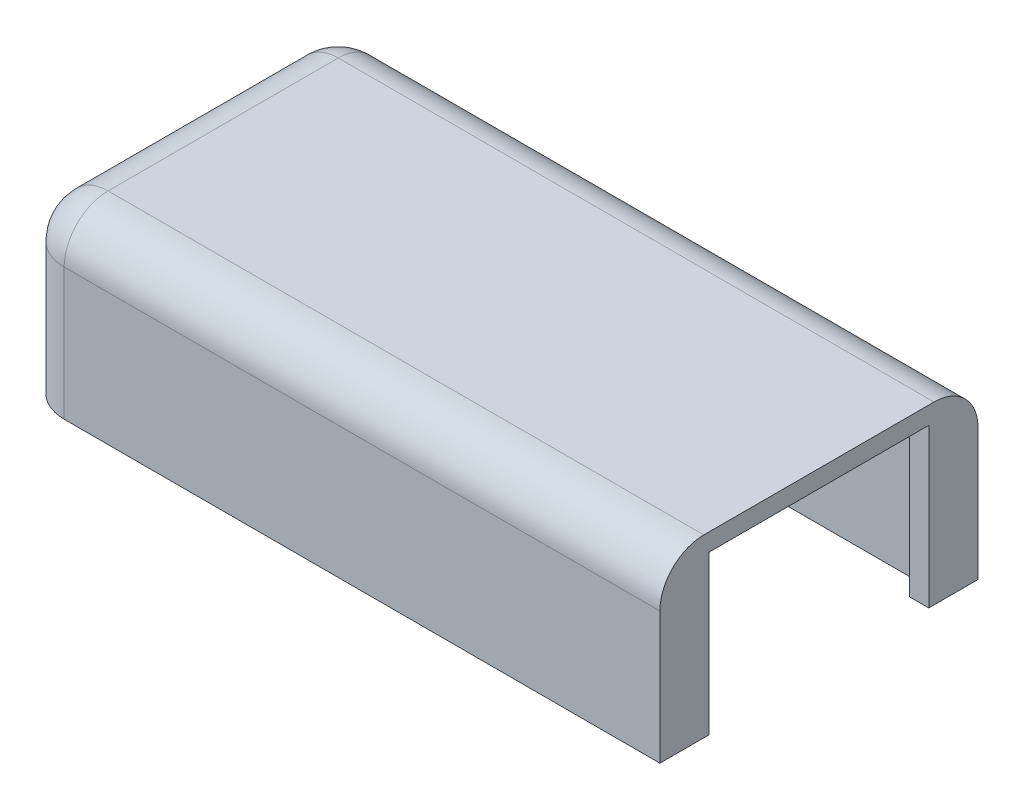
ISO-10303-21;
HEADER;
FILE_DESCRIPTION(('STEP AP214'),'2;1');
FILE_NAME('part.step','',(''),(''),'','','');
FILE_SCHEMA(('AUTOMOTIVE_DESIGN { 1 0 10303 214 1 1 1 1 }'));
ENDSEC;
DATA;
#1=APPLICATION_CONTEXT('core data for automotive mechanical design processes');
#2=APPLICATION_PROTOCOL_DEFINITION('international standard','automotive_design',2000,#1);
#3=PRODUCT_CONTEXT('',#1,'mechanical');
#4=PRODUCT('Part','Part','',(#3));
#5=PRODUCT_RELATED_PRODUCT_CATEGORY('part','',(#4));
#6=PRODUCT_DEFINITION_FORMATION('','',#4);
#7=PRODUCT_DEFINITION_CONTEXT('part definition',#1,'design');
#8=PRODUCT_DEFINITION('design','',#6,#7);
#9=PRODUCT_DEFINITION_SHAPE('','',#8);
#10=(LENGTH_UNIT() NAMED_UNIT(*) SI_UNIT(.MILLI.,.METRE.));
#11=(NAMED_UNIT(*) PLANE_ANGLE_UNIT() SI_UNIT($,.RADIAN.));
#12=(NAMED_UNIT(*) SI_UNIT($,.STERADIAN.) SOLID_ANGLE_UNIT());
#13=UNCERTAINTY_MEASURE_WITH_UNIT(LENGTH_MEASURE(1.E-05),#10,'distance_accuracy_value','');
#14=(GEOMETRIC_REPRESENTATION_CONTEXT(3) GLOBAL_UNCERTAINTY_ASSIGNED_CONTEXT((#13)) GLOBAL_UNIT_ASSIGNED_CONTEXT((#10,
#11,#12)) REPRESENTATION_CONTEXT('',''));
#15=CARTESIAN_POINT('',(0.,0.,0.));
#16=DIRECTION('',(0.,0.,1.));
#17=DIRECTION('',(1.,0.,0.));
#18=AXIS2_PLACEMENT_3D('',#15,#16,#17);
#19=CARTESIAN_POINT('',(0.,20.,-29.));
#20=DIRECTION('',(0.,0.,1.));
#21=DIRECTION('',(1.,0.,0.));
#22=AXIS2_PLACEMENT_3D('',#19,#20,#21);
#23=PLANE('',#22);
#24=DIRECTION('',(0.,-1.,0.));
#25=VECTOR('',#24,1.);
#26=CARTESIAN_POINT('',(67.,20.,-29.));
#27=LINE('',#26,#25);
#28=CARTESIAN_POINT('',(67.,18.,-29.));
#29=VERTEX_POINT('',#28);
#30=CARTESIAN_POINT('',(67.,0.,-29.));
#31=VERTEX_POINT('',#30);
#32=EDGE_CURVE('E195',#29,#31,#27,.T.);
#33=ORIENTED_EDGE('',*,*,#32,.F.);
#34=DIRECTION('',(-1.,0.,0.));
#35=VECTOR('',#34,1.);
#36=CARTESIAN_POINT('',(0.,18.,-29.));
#37=LINE('',#36,#35);
#38=CARTESIAN_POINT('',(0.,18.,-29.));
#39=VERTEX_POINT('',#38);
#40=EDGE_CURVE('E305',#29,#39,#37,.T.);
#41=ORIENTED_EDGE('',*,*,#40,.T.);
#42=DIRECTION('',(0.,-1.,0.));
#43=VECTOR('',#42,1.);
#44=CARTESIAN_POINT('',(0.,20.,-29.));
#45=LINE('',#44,#43);
#46=CARTESIAN_POINT('',(0.,0.,-29.));
#47=VERTEX_POINT('',#46);
#48=EDGE_CURVE('E242',#39,#47,#45,.T.);
#49=ORIENTED_EDGE('',*,*,#48,.T.);
#50=DIRECTION('',(-1.,0.,0.));
#51=VECTOR('',#50,1.);
#52=CARTESIAN_POINT('',(0.,0.,-29.));
#53=LINE('',#52,#51);
#54=EDGE_CURVE('E240',#31,#47,#53,.T.);
#55=ORIENTED_EDGE('',*,*,#54,.F.);
#56=EDGE_LOOP('',(#33,#41,#49,#55));
#57=FACE_BOUND('',#56,.T.);
#58=ADVANCED_FACE('F65',(#57),#23,.T.);
#59=CARTESIAN_POINT('',(0.,20.,0.));
#60=DIRECTION('',(0.,0.,-1.));
#61=DIRECTION('',(-1.,0.,0.));
#62=AXIS2_PLACEMENT_3D('',#59,#60,#61);
#63=PLANE('',#62);
#64=DIRECTION('',(0.,-1.,0.));
#65=VECTOR('',#64,1.);
#66=CARTESIAN_POINT('',(0.,20.,0.));
#67=LINE('',#66,#65);
#68=CARTESIAN_POINT('',(0.,18.,0.));
#69=VERTEX_POINT('',#68);
#70=CARTESIAN_POINT('',(0.,0.,0.));
#71=VERTEX_POINT('',#70);
#72=EDGE_CURVE('E244',#69,#71,#67,.T.);
#73=ORIENTED_EDGE('',*,*,#72,.F.);
#74=DIRECTION('',(1.,0.,0.));
#75=VECTOR('',#74,1.);
#76=CARTESIAN_POINT('',(0.,18.,0.));
#77=LINE('',#76,#75);
#78=CARTESIAN_POINT('',(67.,18.,0.));
#79=VERTEX_POINT('',#78);
#80=EDGE_CURVE('E311',#69,#79,#77,.T.);
#81=ORIENTED_EDGE('',*,*,#80,.T.);
#82=DIRECTION('',(0.,1.,0.));
#83=VECTOR('',#82,1.);
#84=CARTESIAN_POINT('',(67.,20.,0.));
#85=LINE('',#84,#83);
#86=CARTESIAN_POINT('',(67.,0.,0.));
#87=VERTEX_POINT('',#86);
#88=EDGE_CURVE('E199',#87,#79,#85,.T.);
#89=ORIENTED_EDGE('',*,*,#88,.F.);
#90=DIRECTION('',(1.,0.,0.));
#91=VECTOR('',#90,1.);
#92=CARTESIAN_POINT('',(0.,0.,0.));
#93=LINE('',#92,#91);
#94=EDGE_CURVE('E237',#71,#87,#93,.T.);
#95=ORIENTED_EDGE('',*,*,#94,.F.);
#96=EDGE_LOOP('',(#73,#81,#89,#95));
#97=FACE_BOUND('',#96,.T.);
#98=ADVANCED_FACE('F331',(#97),#63,.T.);
#99=CARTESIAN_POINT('',(0.,20.,-29.));
#100=DIRECTION('',(1.,0.,0.));
#101=DIRECTION('',(0.,0.,-1.));
#102=AXIS2_PLACEMENT_3D('',#99,#100,#101);
#103=PLANE('',#102);
#104=ORIENTED_EDGE('',*,*,#48,.F.);
#105=DIRECTION('',(0.,0.,1.));
#106=VECTOR('',#105,1.);
#107=CARTESIAN_POINT('',(0.,18.,-29.));
#108=LINE('',#107,#106);
#109=EDGE_CURVE('E309',#39,#69,#108,.T.);
#110=ORIENTED_EDGE('',*,*,#109,.T.);
#111=ORIENTED_EDGE('',*,*,#72,.T.);
#112=DIRECTION('',(0.,0.,1.));
#113=VECTOR('',#112,1.);
#114=CARTESIAN_POINT('',(0.,0.,-29.));
#115=LINE('',#114,#113);
#116=EDGE_CURVE('E234',#47,#71,#115,.T.);
#117=ORIENTED_EDGE('',*,*,#116,.F.);
#118=EDGE_LOOP('',(#104,#110,#111,#117));
#119=FACE_BOUND('',#118,.T.);
#120=ADVANCED_FACE('F325',(#119),#103,.T.);
#121=CARTESIAN_POINT('',(67.,20.,-2.));
#122=DIRECTION('',(1.,0.,0.));
#123=DIRECTION('',(0.,0.,-1.));
#124=AXIS2_PLACEMENT_3D('',#121,#122,#123);
#125=PLANE('',#124);
#126=DIRECTION('',(0.,0.,1.));
#127=VECTOR('',#126,1.);
#128=CARTESIAN_POINT('',(67.,18.,-2.));
#129=LINE('',#128,#127);
#130=CARTESIAN_POINT('',(67.,18.,-2.));
#131=VERTEX_POINT('',#130);
#132=EDGE_CURVE('E313',#131,#79,#129,.T.);
#133=ORIENTED_EDGE('',*,*,#132,.F.);
#134=DIRECTION('',(0.,1.,0.));
#135=VECTOR('',#134,1.);
#136=CARTESIAN_POINT('',(67.,20.,-2.));
#137=LINE('',#136,#135);
#138=CARTESIAN_POINT('',(67.,0.,-2.));
#139=VERTEX_POINT('',#138);
#140=EDGE_CURVE('E214',#139,#131,#137,.T.);
#141=ORIENTED_EDGE('',*,*,#140,.F.);
#142=DIRECTION('',(0.,0.,1.));
#143=VECTOR('',#142,1.);
#144=CARTESIAN_POINT('',(67.,0.,-2.));
#145=LINE('',#144,#143);
#146=EDGE_CURVE('E217',#139,#87,#145,.T.);
#147=ORIENTED_EDGE('',*,*,#146,.T.);
#148=ORIENTED_EDGE('',*,*,#88,.T.);
#149=EDGE_LOOP('',(#133,#141,#147,#148));
#150=FACE_BOUND('',#149,.T.);
#151=ADVANCED_FACE('F337',(#150),#125,.F.);
#152=CARTESIAN_POINT('',(0.,0.,-2.));
#153=DIRECTION('',(0.,0.,-1.));
#154=DIRECTION('',(-1.,0.,0.));
#155=AXIS2_PLACEMENT_3D('',#152,#153,#154);
#156=PLANE('',#155);
#157=ORIENTED_EDGE('',*,*,#140,.T.);
#158=DIRECTION('',(1.,0.,0.));
#159=VECTOR('',#158,1.);
#160=CARTESIAN_POINT('',(0.,18.,-2.));
#161=LINE('',#160,#159);
#162=CARTESIAN_POINT('',(69.2,18.,-2.));
#163=VERTEX_POINT('',#162);
#164=EDGE_CURVE('E208',#131,#163,#161,.T.);
#165=ORIENTED_EDGE('',*,*,#164,.T.);
#166=DIRECTION('',(0.,-1.,0.));
#167=VECTOR('',#166,1.);
#168=CARTESIAN_POINT('',(69.2,20.,-2.));
#169=LINE('',#168,#167);
#170=CARTESIAN_POINT('',(69.2,0.,-2.));
#171=VERTEX_POINT('',#170);
#172=EDGE_CURVE('E210',#163,#171,#169,.T.);
#173=ORIENTED_EDGE('',*,*,#172,.T.);
#174=DIRECTION('',(-1.,0.,0.));
#175=VECTOR('',#174,1.);
#176=CARTESIAN_POINT('',(69.2,0.,-2.));
#177=LINE('',#176,#175);
#178=EDGE_CURVE('E212',#171,#139,#177,.T.);
#179=ORIENTED_EDGE('',*,*,#178,.T.);
#180=EDGE_LOOP('',(#157,#165,#173,#179));
#181=FACE_BOUND('',#180,.T.);
#182=ADVANCED_FACE('F339',(#181),#156,.T.);
#183=CARTESIAN_POINT('',(67.,20.,-27.));
#184=DIRECTION('',(1.,0.,0.));
#185=DIRECTION('',(0.,0.,-1.));
#186=AXIS2_PLACEMENT_3D('',#183,#184,#185);
#187=PLANE('',#186);
#188=DIRECTION('',(0.,0.,1.));
#189=VECTOR('',#188,1.);
#190=CARTESIAN_POINT('',(67.,18.,-27.));
#191=LINE('',#190,#189);
#192=CARTESIAN_POINT('',(67.,18.,-27.));
#193=VERTEX_POINT('',#192);
#194=EDGE_CURVE('E300',#29,#193,#191,.T.);
#195=ORIENTED_EDGE('',*,*,#194,.F.);
#196=ORIENTED_EDGE('',*,*,#32,.T.);
#197=DIRECTION('',(0.,0.,-1.));
#198=VECTOR('',#197,1.);
#199=CARTESIAN_POINT('',(67.,0.,-27.));
#200=LINE('',#199,#198);
#201=CARTESIAN_POINT('',(67.,0.,-27.));
#202=VERTEX_POINT('',#201);
#203=EDGE_CURVE('E192',#202,#31,#200,.T.);
#204=ORIENTED_EDGE('',*,*,#203,.F.);
#205=DIRECTION('',(0.,-1.,0.));
#206=VECTOR('',#205,1.);
#207=CARTESIAN_POINT('',(67.,20.,-27.));
#208=LINE('',#207,#206);
#209=EDGE_CURVE('E179',#193,#202,#208,.T.);
#210=ORIENTED_EDGE('',*,*,#209,.F.);
#211=EDGE_LOOP('',(#195,#196,#204,#210));
#212=FACE_BOUND('',#211,.T.);
#213=ADVANCED_FACE('F193',(#212),#187,.F.);
#214=CARTESIAN_POINT('',(0.,0.,-27.));
#215=DIRECTION('',(0.,0.,-1.));
#216=DIRECTION('',(-1.,0.,0.));
#217=AXIS2_PLACEMENT_3D('',#214,#215,#216);
#218=PLANE('',#217);
#219=DIRECTION('',(1.,0.,0.));
#220=VECTOR('',#219,1.);
#221=CARTESIAN_POINT('',(0.,18.,-27.));
#222=LINE('',#221,#220);
#223=CARTESIAN_POINT('',(69.2,18.,-27.));
#224=VERTEX_POINT('',#223);
#225=EDGE_CURVE('E186',#193,#224,#222,.T.);
#226=ORIENTED_EDGE('',*,*,#225,.F.);
#227=ORIENTED_EDGE('',*,*,#209,.T.);
#228=DIRECTION('',(1.,0.,0.));
#229=VECTOR('',#228,1.);
#230=CARTESIAN_POINT('',(69.2,0.,-27.));
#231=LINE('',#230,#229);
#232=CARTESIAN_POINT('',(69.2,0.,-27.));
#233=VERTEX_POINT('',#232);
#234=EDGE_CURVE('E183',#202,#233,#231,.T.);
#235=ORIENTED_EDGE('',*,*,#234,.T.);
#236=DIRECTION('',(0.,1.,0.));
#237=VECTOR('',#236,1.);
#238=CARTESIAN_POINT('',(69.2,20.,-27.));
#239=LINE('',#238,#237);
#240=EDGE_CURVE('E189',#233,#224,#239,.T.);
#241=ORIENTED_EDGE('',*,*,#240,.T.);
#242=EDGE_LOOP('',(#226,#227,#235,#241));
#243=FACE_BOUND('',#242,.T.);
#244=ADVANCED_FACE('F181',(#243),#218,.F.);
#245=CARTESIAN_POINT('',(0.,20.,0.));
#246=DIRECTION('',(0.,1.,0.));
#247=DIRECTION('',(0.,0.,1.));
#248=AXIS2_PLACEMENT_3D('',#245,#246,#247);
#249=PLANE('',#248);
#250=DIRECTION('',(-1.,0.,0.));
#251=VECTOR('',#250,1.);
#252=CARTESIAN_POINT('',(-3.59999999999997,20.,-27.6));
#253=LINE('',#252,#251);
#254=CARTESIAN_POINT('',(69.2,20.,-27.6));
#255=VERTEX_POINT('',#254);
#256=CARTESIAN_POINT('',(1.40000000000003,20.,-27.6));
#257=VERTEX_POINT('',#256);
#258=EDGE_CURVE('E255',#255,#257,#253,.T.);
#259=ORIENTED_EDGE('',*,*,#258,.T.);
#260=DIRECTION('',(0.,0.,1.));
#261=VECTOR('',#260,1.);
#262=CARTESIAN_POINT('',(1.4,20.,-1.4));
#263=LINE('',#262,#261);
#264=CARTESIAN_POINT('',(1.4,20.,-1.4));
#265=VERTEX_POINT('',#264);
#266=EDGE_CURVE('E12',#257,#265,#263,.T.);
#267=ORIENTED_EDGE('',*,*,#266,.T.);
#268=DIRECTION('',(1.,0.,0.));
#269=VECTOR('',#268,1.);
#270=CARTESIAN_POINT('',(69.2,20.,-1.4));
#271=LINE('',#270,#269);
#272=CARTESIAN_POINT('',(69.2,20.,-1.4));
#273=VERTEX_POINT('',#272);
#274=EDGE_CURVE('E261',#265,#273,#271,.T.);
#275=ORIENTED_EDGE('',*,*,#274,.T.);
#276=DIRECTION('',(0.,0.,1.));
#277=VECTOR('',#276,1.);
#278=CARTESIAN_POINT('',(69.2,20.,3.6));
#279=LINE('',#278,#277);
#280=EDGE_CURVE('E231',#255,#273,#279,.T.);
#281=ORIENTED_EDGE('',*,*,#280,.F.);
#282=EDGE_LOOP('',(#259,#267,#275,#281));
#283=FACE_BOUND('',#282,.T.);
#284=ADVANCED_FACE('F368',(#283),#249,.T.);
#285=CARTESIAN_POINT('',(0.,0.,0.));
#286=DIRECTION('',(0.,1.,0.));
#287=DIRECTION('',(0.,0.,1.));
#288=AXIS2_PLACEMENT_3D('',#285,#286,#287);
#289=PLANE('',#288);
#290=DIRECTION('',(0.,0.,1.));
#291=VECTOR('',#290,1.);
#292=CARTESIAN_POINT('',(-3.59999999999997,0.,-29.));
#293=LINE('',#292,#291);
#294=CARTESIAN_POINT('',(-3.59999999999997,0.,-27.6));
#295=VERTEX_POINT('',#294);
#296=CARTESIAN_POINT('',(-3.6,0.,-1.40000000000001));
#297=VERTEX_POINT('',#296);
#298=EDGE_CURVE('E246',#295,#297,#293,.T.);
#299=ORIENTED_EDGE('',*,*,#298,.F.);
#300=CARTESIAN_POINT('',(1.40000000000003,0.,-27.6));
#301=DIRECTION('',(0.,1.,0.));
#302=DIRECTION('',(0.,0.,1.));
#303=AXIS2_PLACEMENT_3D('',#300,#301,#302);
#304=CIRCLE('',#303,5.);
#305=CARTESIAN_POINT('',(1.40000000000003,0.,-32.6));
#306=VERTEX_POINT('',#305);
#307=EDGE_CURVE('E276',#295,#306,#304,.F.);
#308=ORIENTED_EDGE('',*,*,#307,.T.);
#309=DIRECTION('',(-1.,0.,0.));
#310=VECTOR('',#309,1.);
#311=CARTESIAN_POINT('',(0.,0.,-32.6));
#312=LINE('',#311,#310);
#313=CARTESIAN_POINT('',(69.2,0.,-32.6));
#314=VERTEX_POINT('',#313);
#315=EDGE_CURVE('E251',#314,#306,#312,.T.);
#316=ORIENTED_EDGE('',*,*,#315,.F.);
#317=DIRECTION('',(0.,0.,-1.));
#318=VECTOR('',#317,1.);
#319=CARTESIAN_POINT('',(69.2,0.,-29.));
#320=LINE('',#319,#318);
#321=EDGE_CURVE('E204',#233,#314,#320,.T.);
#322=ORIENTED_EDGE('',*,*,#321,.F.);
#323=ORIENTED_EDGE('',*,*,#234,.F.);
#324=ORIENTED_EDGE('',*,*,#203,.T.);
#325=ORIENTED_EDGE('',*,*,#54,.T.);
#326=ORIENTED_EDGE('',*,*,#116,.T.);
#327=ORIENTED_EDGE('',*,*,#94,.T.);
#328=ORIENTED_EDGE('',*,*,#146,.F.);
#329=ORIENTED_EDGE('',*,*,#178,.F.);
#330=DIRECTION('',(0.,0.,-1.));
#331=VECTOR('',#330,1.);
#332=CARTESIAN_POINT('',(69.2,0.,3.6));
#333=LINE('',#332,#331);
#334=CARTESIAN_POINT('',(69.2,0.,3.6));
#335=VERTEX_POINT('',#334);
#336=EDGE_CURVE('E228',#335,#171,#333,.T.);
#337=ORIENTED_EDGE('',*,*,#336,.F.);
#338=DIRECTION('',(1.,0.,0.));
#339=VECTOR('',#338,1.);
#340=CARTESIAN_POINT('',(0.,0.,3.6));
#341=LINE('',#340,#339);
#342=CARTESIAN_POINT('',(1.4,0.,3.6));
#343=VERTEX_POINT('',#342);
#344=EDGE_CURVE('E249',#343,#335,#341,.T.);
#345=ORIENTED_EDGE('',*,*,#344,.F.);
#346=CARTESIAN_POINT('',(1.4,0.,-1.4));
#347=DIRECTION('',(0.,1.,0.));
#348=DIRECTION('',(0.,0.,1.));
#349=AXIS2_PLACEMENT_3D('',#346,#347,#348);
#350=CIRCLE('',#349,5.);
#351=EDGE_CURVE('E274',#343,#297,#350,.F.);
#352=ORIENTED_EDGE('',*,*,#351,.T.);
#353=EDGE_LOOP('',(#299,#308,#316,#322,#323,#324,#325,#326,#327,#328,#329,#337,#345,#352));
#354=FACE_BOUND('',#353,.T.);
#355=ADVANCED_FACE('F202',(#354),#289,.F.);
#356=CARTESIAN_POINT('',(-3.59999999999997,20.,-29.));
#357=DIRECTION('',(1.,0.,0.));
#358=DIRECTION('',(0.,0.,-1.));
#359=AXIS2_PLACEMENT_3D('',#356,#357,#358);
#360=PLANE('',#359);
#361=DIRECTION('',(0.,0.,1.));
#362=VECTOR('',#361,1.);
#363=CARTESIAN_POINT('',(-3.59999999999997,15.,-27.6));
#364=LINE('',#363,#362);
#365=CARTESIAN_POINT('',(-3.6,15.,-1.40000000000001));
#366=VERTEX_POINT('',#365);
#367=CARTESIAN_POINT('',(-3.59999999999997,15.,-27.6));
#368=VERTEX_POINT('',#367);
#369=EDGE_CURVE('E267',#366,#368,#364,.F.);
#370=ORIENTED_EDGE('',*,*,#369,.T.);
#371=DIRECTION('',(0.,-1.,0.));
#372=VECTOR('',#371,1.);
#373=CARTESIAN_POINT('',(-3.59999999999997,20.,-27.6));
#374=LINE('',#373,#372);
#375=EDGE_CURVE('E271',#368,#295,#374,.T.);
#376=ORIENTED_EDGE('',*,*,#375,.T.);
#377=ORIENTED_EDGE('',*,*,#298,.T.);
#378=DIRECTION('',(0.,-1.,0.));
#379=VECTOR('',#378,1.);
#380=CARTESIAN_POINT('',(-3.6,20.,-1.40000000000001));
#381=LINE('',#380,#379);
#382=EDGE_CURVE('E269',#297,#366,#381,.F.);
#383=ORIENTED_EDGE('',*,*,#382,.T.);
#384=EDGE_LOOP('',(#370,#376,#377,#383));
#385=FACE_BOUND('',#384,.T.);
#386=ADVANCED_FACE('F349',(#385),#360,.F.);
#387=CARTESIAN_POINT('',(0.,20.,3.6));
#388=DIRECTION('',(0.,0.,-1.));
#389=DIRECTION('',(-1.,0.,0.));
#390=AXIS2_PLACEMENT_3D('',#387,#388,#389);
#391=PLANE('',#390);
#392=DIRECTION('',(1.,0.,0.));
#393=VECTOR('',#392,1.);
#394=CARTESIAN_POINT('',(-3.6,15.,3.6));
#395=LINE('',#394,#393);
#396=CARTESIAN_POINT('',(69.2,15.,3.6));
#397=VERTEX_POINT('',#396);
#398=CARTESIAN_POINT('',(1.4,15.,3.6));
#399=VERTEX_POINT('',#398);
#400=EDGE_CURVE('E265',#397,#399,#395,.F.);
#401=ORIENTED_EDGE('',*,*,#400,.T.);
#402=DIRECTION('',(0.,-1.,0.));
#403=VECTOR('',#402,1.);
#404=CARTESIAN_POINT('',(1.4,20.,3.6));
#405=LINE('',#404,#403);
#406=EDGE_CURVE('E282',#399,#343,#405,.T.);
#407=ORIENTED_EDGE('',*,*,#406,.T.);
#408=ORIENTED_EDGE('',*,*,#344,.T.);
#409=DIRECTION('',(0.,-1.,0.));
#410=VECTOR('',#409,1.);
#411=CARTESIAN_POINT('',(69.2,20.,3.6));
#412=LINE('',#411,#410);
#413=EDGE_CURVE('E225',#397,#335,#412,.T.);
#414=ORIENTED_EDGE('',*,*,#413,.F.);
#415=EDGE_LOOP('',(#401,#407,#408,#414));
#416=FACE_BOUND('',#415,.T.);
#417=ADVANCED_FACE('F395',(#416),#391,.F.);
#418=CARTESIAN_POINT('',(0.,20.,-32.6));
#419=DIRECTION('',(0.,0.,1.));
#420=DIRECTION('',(1.,0.,0.));
#421=AXIS2_PLACEMENT_3D('',#418,#419,#420);
#422=PLANE('',#421);
#423=ORIENTED_EDGE('',*,*,#315,.T.);
#424=DIRECTION('',(0.,-1.,0.));
#425=VECTOR('',#424,1.);
#426=CARTESIAN_POINT('',(1.40000000000003,20.,-32.6));
#427=LINE('',#426,#425);
#428=CARTESIAN_POINT('',(1.40000000000003,15.,-32.6));
#429=VERTEX_POINT('',#428);
#430=EDGE_CURVE('E278',#306,#429,#427,.F.);
#431=ORIENTED_EDGE('',*,*,#430,.T.);
#432=DIRECTION('',(-1.,0.,0.));
#433=VECTOR('',#432,1.);
#434=CARTESIAN_POINT('',(69.2,15.,-32.6));
#435=LINE('',#434,#433);
#436=CARTESIAN_POINT('',(69.2,15.,-32.6));
#437=VERTEX_POINT('',#436);
#438=EDGE_CURVE('E257',#429,#437,#435,.F.);
#439=ORIENTED_EDGE('',*,*,#438,.T.);
#440=DIRECTION('',(0.,1.,0.));
#441=VECTOR('',#440,1.);
#442=CARTESIAN_POINT('',(69.2,20.,-32.6));
#443=LINE('',#442,#441);
#444=EDGE_CURVE('E221',#314,#437,#443,.T.);
#445=ORIENTED_EDGE('',*,*,#444,.F.);
#446=EDGE_LOOP('',(#423,#431,#439,#445));
#447=FACE_BOUND('',#446,.T.);
#448=ADVANCED_FACE('F356',(#447),#422,.F.);
#449=CARTESIAN_POINT('',(69.2,0.,0.));
#450=DIRECTION('',(1.,0.,0.));
#451=DIRECTION('',(0.,0.,-1.));
#452=AXIS2_PLACEMENT_3D('',#449,#450,#451);
#453=PLANE('',#452);
#454=ORIENTED_EDGE('',*,*,#280,.T.);
#455=CARTESIAN_POINT('',(69.2,15.,-1.4));
#456=DIRECTION('',(1.,0.,0.));
#457=DIRECTION('',(0.,0.,-1.));
#458=AXIS2_PLACEMENT_3D('',#455,#456,#457);
#459=CIRCLE('',#458,5.);
#460=EDGE_CURVE('E263',#273,#397,#459,.T.);
#461=ORIENTED_EDGE('',*,*,#460,.T.);
#462=ORIENTED_EDGE('',*,*,#413,.T.);
#463=ORIENTED_EDGE('',*,*,#336,.T.);
#464=ORIENTED_EDGE('',*,*,#172,.F.);
#465=DIRECTION('',(0.,0.,-1.));
#466=VECTOR('',#465,1.);
#467=CARTESIAN_POINT('',(69.2,18.,-32.6));
#468=LINE('',#467,#466);
#469=EDGE_CURVE('E296',#163,#224,#468,.T.);
#470=ORIENTED_EDGE('',*,*,#469,.T.);
#471=ORIENTED_EDGE('',*,*,#240,.F.);
#472=ORIENTED_EDGE('',*,*,#321,.T.);
#473=ORIENTED_EDGE('',*,*,#444,.T.);
#474=CARTESIAN_POINT('',(69.2,15.,-27.6));
#475=DIRECTION('',(1.,0.,0.));
#476=DIRECTION('',(0.,0.,-1.));
#477=AXIS2_PLACEMENT_3D('',#474,#475,#476);
#478=CIRCLE('',#477,5.);
#479=EDGE_CURVE('E259',#437,#255,#478,.T.);
#480=ORIENTED_EDGE('',*,*,#479,.T.);
#481=EDGE_LOOP('',(#454,#461,#462,#463,#464,#470,#471,#472,#473,#480));
#482=FACE_BOUND('',#481,.T.);
#483=ADVANCED_FACE('F340',(#482),#453,.T.);
#484=CARTESIAN_POINT('',(0.,18.,0.));
#485=DIRECTION('',(0.,1.,0.));
#486=DIRECTION('',(0.,0.,1.));
#487=AXIS2_PLACEMENT_3D('',#484,#485,#486);
#488=PLANE('',#487);
#489=ORIENTED_EDGE('',*,*,#164,.F.);
#490=ORIENTED_EDGE('',*,*,#132,.T.);
#491=ORIENTED_EDGE('',*,*,#80,.F.);
#492=ORIENTED_EDGE('',*,*,#109,.F.);
#493=ORIENTED_EDGE('',*,*,#40,.F.);
#494=ORIENTED_EDGE('',*,*,#194,.T.);
#495=ORIENTED_EDGE('',*,*,#225,.T.);
#496=ORIENTED_EDGE('',*,*,#469,.F.);
#497=EDGE_LOOP('',(#489,#490,#491,#492,#493,#494,#495,#496));
#498=FACE_BOUND('',#497,.T.);
#499=ADVANCED_FACE('F318',(#498),#488,.F.);
#500=CARTESIAN_POINT('',(0.,15.,-27.6));
#501=DIRECTION('',(1.,0.,0.));
#502=DIRECTION('',(0.,0.,-1.));
#503=AXIS2_PLACEMENT_3D('',#500,#501,#502);
#504=CYLINDRICAL_SURFACE('',#503,5.);
#505=ORIENTED_EDGE('',*,*,#438,.F.);
#506=CARTESIAN_POINT('',(1.40000000000003,15.,-27.6));
#507=DIRECTION('',(1.,0.,0.));
#508=DIRECTION('',(0.,0.,-1.));
#509=AXIS2_PLACEMENT_3D('',#506,#507,#508);
#510=CIRCLE('',#509,5.);
#511=EDGE_CURVE('E280',#429,#257,#510,.T.);
#512=ORIENTED_EDGE('',*,*,#511,.T.);
#513=ORIENTED_EDGE('',*,*,#258,.F.);
#514=ORIENTED_EDGE('',*,*,#479,.F.);
#515=EDGE_LOOP('',(#505,#512,#513,#514));
#516=FACE_BOUND('',#515,.T.);
#517=ADVANCED_FACE('F365',(#516),#504,.T.);
#518=CARTESIAN_POINT('',(0.,15.,-1.4));
#519=DIRECTION('',(-1.,0.,0.));
#520=DIRECTION('',(0.,0.,1.));
#521=AXIS2_PLACEMENT_3D('',#518,#519,#520);
#522=CYLINDRICAL_SURFACE('',#521,5.);
#523=ORIENTED_EDGE('',*,*,#274,.F.);
#524=CARTESIAN_POINT('',(1.4,15.,-1.4));
#525=DIRECTION('',(-1.,0.,0.));
#526=DIRECTION('',(0.,0.,1.));
#527=AXIS2_PLACEMENT_3D('',#524,#525,#526);
#528=CIRCLE('',#527,5.);
#529=EDGE_CURVE('E74',#265,#399,#528,.F.);
#530=ORIENTED_EDGE('',*,*,#529,.T.);
#531=ORIENTED_EDGE('',*,*,#400,.F.);
#532=ORIENTED_EDGE('',*,*,#460,.F.);
#533=EDGE_LOOP('',(#523,#530,#531,#532));
#534=FACE_BOUND('',#533,.T.);
#535=ADVANCED_FACE('F402',(#534),#522,.T.);
#536=CARTESIAN_POINT('',(1.4,20.,-1.4));
#537=DIRECTION('',(0.,-1.,0.));
#538=DIRECTION('',(0.,0.,-1.));
#539=AXIS2_PLACEMENT_3D('',#536,#537,#538);
#540=CYLINDRICAL_SURFACE('',#539,5.);
#541=ORIENTED_EDGE('',*,*,#351,.F.);
#542=ORIENTED_EDGE('',*,*,#406,.F.);
#543=CARTESIAN_POINT('',(1.4,15.,-1.4));
#544=DIRECTION('',(0.,1.,0.));
#545=DIRECTION('',(0.,0.,1.));
#546=AXIS2_PLACEMENT_3D('',#543,#544,#545);
#547=CIRCLE('',#546,5.);
#548=EDGE_CURVE('E69',#366,#399,#547,.T.);
#549=ORIENTED_EDGE('',*,*,#548,.F.);
#550=ORIENTED_EDGE('',*,*,#382,.F.);
#551=EDGE_LOOP('',(#541,#542,#549,#550));
#552=FACE_BOUND('',#551,.T.);
#553=ADVANCED_FACE('F67',(#552),#540,.T.);
#554=CARTESIAN_POINT('',(1.4,15.,-1.4));
#555=DIRECTION('',(1.,0.,0.));
#556=DIRECTION('',(0.,0.,-1.));
#557=AXIS2_PLACEMENT_3D('',#554,#555,#556);
#558=SPHERICAL_SURFACE('',#557,5.);
#559=ORIENTED_EDGE('',*,*,#548,.T.);
#560=ORIENTED_EDGE('',*,*,#529,.F.);
#561=CARTESIAN_POINT('',(1.4,15.,-1.4));
#562=DIRECTION('',(0.,0.,-1.));
#563=DIRECTION('',(-1.,0.,0.));
#564=AXIS2_PLACEMENT_3D('',#561,#562,#563);
#565=CIRCLE('',#564,5.);
#566=EDGE_CURVE('E290',#366,#265,#565,.T.);
#567=ORIENTED_EDGE('',*,*,#566,.F.);
#568=EDGE_LOOP('',(#559,#560,#567));
#569=FACE_BOUND('',#568,.T.);
#570=ADVANCED_FACE('F371',(#569),#558,.T.);
#571=CARTESIAN_POINT('',(1.4,15.,0.));
#572=DIRECTION('',(0.,0.,-1.));
#573=DIRECTION('',(-1.,0.,0.));
#574=AXIS2_PLACEMENT_3D('',#571,#572,#573);
#575=CYLINDRICAL_SURFACE('',#574,5.);
#576=ORIENTED_EDGE('',*,*,#566,.T.);
#577=ORIENTED_EDGE('',*,*,#266,.F.);
#578=CARTESIAN_POINT('',(1.40000000000003,15.,-27.6));
#579=DIRECTION('',(0.,0.,-1.));
#580=DIRECTION('',(-1.,0.,0.));
#581=AXIS2_PLACEMENT_3D('',#578,#579,#580);
#582=CIRCLE('',#581,5.);
#583=EDGE_CURVE('E288',#368,#257,#582,.T.);
#584=ORIENTED_EDGE('',*,*,#583,.F.);
#585=ORIENTED_EDGE('',*,*,#369,.F.);
#586=EDGE_LOOP('',(#576,#577,#584,#585));
#587=FACE_BOUND('',#586,.T.);
#588=ADVANCED_FACE('F369',(#587),#575,.T.);
#589=CARTESIAN_POINT('',(1.40000000000003,15.,-27.6));
#590=DIRECTION('',(1.,0.,0.));
#591=DIRECTION('',(0.,0.,-1.));
#592=AXIS2_PLACEMENT_3D('',#589,#590,#591);
#593=SPHERICAL_SURFACE('',#592,5.);
#594=ORIENTED_EDGE('',*,*,#583,.T.);
#595=ORIENTED_EDGE('',*,*,#511,.F.);
#596=CARTESIAN_POINT('',(1.40000000000003,15.,-27.6));
#597=DIRECTION('',(0.,-1.,0.));
#598=DIRECTION('',(0.,0.,-1.));
#599=AXIS2_PLACEMENT_3D('',#596,#597,#598);
#600=CIRCLE('',#599,5.);
#601=EDGE_CURVE('E285',#368,#429,#600,.T.);
#602=ORIENTED_EDGE('',*,*,#601,.F.);
#603=EDGE_LOOP('',(#594,#595,#602));
#604=FACE_BOUND('',#603,.T.);
#605=ADVANCED_FACE('F362',(#604),#593,.T.);
#606=CARTESIAN_POINT('',(1.40000000000003,20.,-27.6));
#607=DIRECTION('',(0.,-1.,0.));
#608=DIRECTION('',(0.,0.,-1.));
#609=AXIS2_PLACEMENT_3D('',#606,#607,#608);
#610=CYLINDRICAL_SURFACE('',#609,5.);
#611=ORIENTED_EDGE('',*,*,#601,.T.);
#612=ORIENTED_EDGE('',*,*,#430,.F.);
#613=ORIENTED_EDGE('',*,*,#307,.F.);
#614=ORIENTED_EDGE('',*,*,#375,.F.);
#615=EDGE_LOOP('',(#611,#612,#613,#614));
#616=FACE_BOUND('',#615,.T.);
#617=ADVANCED_FACE('F358',(#616),#610,.T.);
#618=CLOSED_SHELL('',(#58,#98,#120,#151,#182,#213,#244,#284,#355,#386,#417,#448,#483,#499,#517,
#535,#553,#570,#588,#605,#617));
#619=MANIFOLD_SOLID_BREP('B2',#618);
#620=ADVANCED_BREP_SHAPE_REPRESENTATION('',(#18,#619),#14);
#621=SHAPE_DEFINITION_REPRESENTATION(#9,#620);
ENDSEC;
END-ISO-10303-21;
